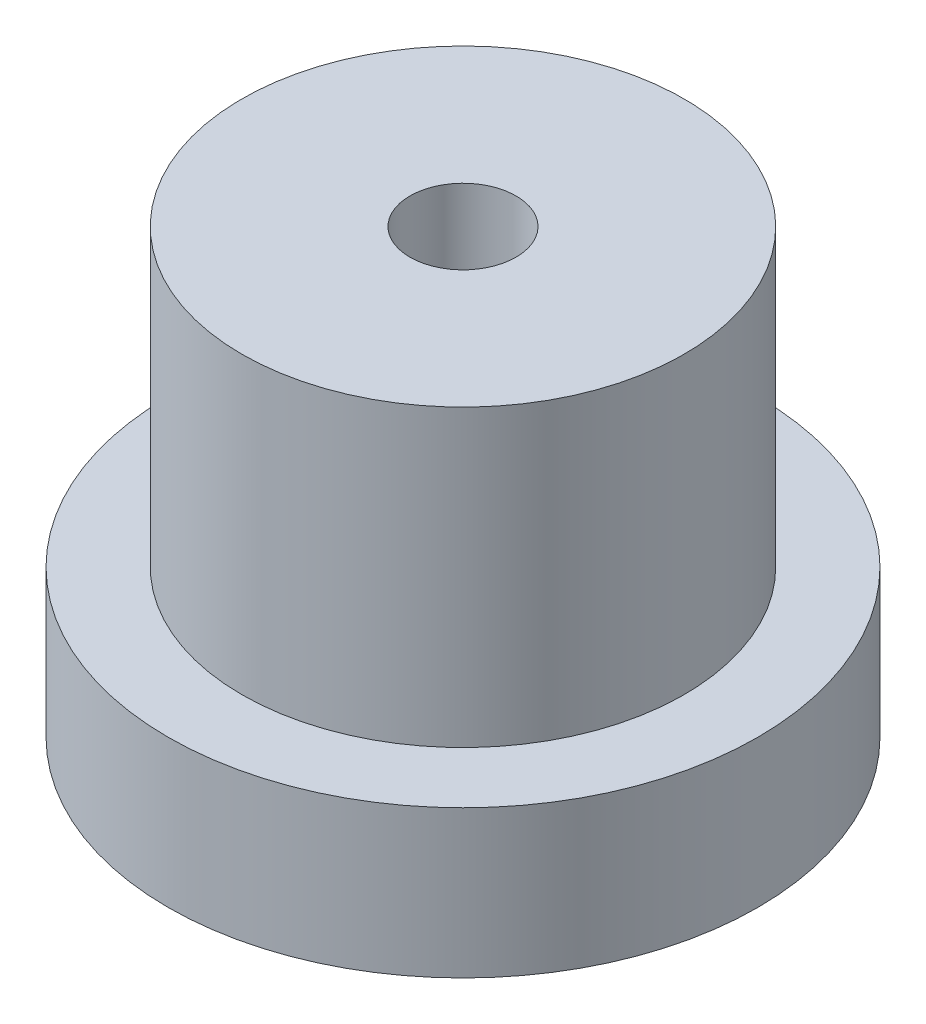
ISO-10303-21;
HEADER;
FILE_DESCRIPTION(('STEP AP214'),'2;1');
FILE_NAME('part.step','',(''),(''),'','','');
FILE_SCHEMA(('AUTOMOTIVE_DESIGN { 1 0 10303 214 1 1 1 1 }'));
ENDSEC;
DATA;
#1=APPLICATION_CONTEXT('core data for automotive mechanical design processes');
#2=APPLICATION_PROTOCOL_DEFINITION('international standard','automotive_design',2000,#1);
#3=PRODUCT_CONTEXT('',#1,'mechanical');
#4=PRODUCT('Part','Part','',(#3));
#5=PRODUCT_RELATED_PRODUCT_CATEGORY('part','',(#4));
#6=PRODUCT_DEFINITION_FORMATION('','',#4);
#7=PRODUCT_DEFINITION_CONTEXT('part definition',#1,'design');
#8=PRODUCT_DEFINITION('design','',#6,#7);
#9=PRODUCT_DEFINITION_SHAPE('','',#8);
#10=(LENGTH_UNIT() NAMED_UNIT(*) SI_UNIT(.MILLI.,.METRE.));
#11=(NAMED_UNIT(*) PLANE_ANGLE_UNIT() SI_UNIT($,.RADIAN.));
#12=(NAMED_UNIT(*) SI_UNIT($,.STERADIAN.) SOLID_ANGLE_UNIT());
#13=UNCERTAINTY_MEASURE_WITH_UNIT(LENGTH_MEASURE(1.E-05),#10,'distance_accuracy_value','');
#14=(GEOMETRIC_REPRESENTATION_CONTEXT(3) GLOBAL_UNCERTAINTY_ASSIGNED_CONTEXT((#13)) GLOBAL_UNIT_ASSIGNED_CONTEXT((#10,
#11,#12)) REPRESENTATION_CONTEXT('',''));
#15=CARTESIAN_POINT('',(0.,0.,0.));
#16=DIRECTION('',(0.,0.,1.));
#17=DIRECTION('',(1.,0.,0.));
#18=AXIS2_PLACEMENT_3D('',#15,#16,#17);
#19=CARTESIAN_POINT('',(0.,5.,0.));
#20=DIRECTION('',(0.,-1.,0.));
#21=DIRECTION('',(0.,0.,-1.));
#22=AXIS2_PLACEMENT_3D('',#19,#20,#21);
#23=CYLINDRICAL_SURFACE('',#22,10.);
#24=CARTESIAN_POINT('',(0.,5.,0.));
#25=DIRECTION('',(0.,1.,0.));
#26=DIRECTION('',(0.,0.,1.));
#27=AXIS2_PLACEMENT_3D('',#24,#25,#26);
#28=CIRCLE('',#27,10.);
#29=CARTESIAN_POINT('',(0.,5.,10.));
#30=VERTEX_POINT('',#29);
#31=EDGE_CURVE('E47',#30,#30,#28,.T.);
#32=ORIENTED_EDGE('',*,*,#31,.F.);
#33=EDGE_LOOP('',(#32));
#34=FACE_BOUND('',#33,.T.);
#35=CARTESIAN_POINT('',(0.,0.,0.));
#36=DIRECTION('',(0.,1.,0.));
#37=DIRECTION('',(0.,0.,1.));
#38=AXIS2_PLACEMENT_3D('',#35,#36,#37);
#39=CIRCLE('',#38,10.);
#40=CARTESIAN_POINT('',(0.,0.,10.));
#41=VERTEX_POINT('',#40);
#42=EDGE_CURVE('E42',#41,#41,#39,.T.);
#43=ORIENTED_EDGE('',*,*,#42,.T.);
#44=EDGE_LOOP('',(#43));
#45=FACE_BOUND('',#44,.T.);
#46=ADVANCED_FACE('F39',(#34,#45),#23,.T.);
#47=CARTESIAN_POINT('',(0.,5.,0.));
#48=DIRECTION('',(0.,1.,0.));
#49=DIRECTION('',(0.,0.,1.));
#50=AXIS2_PLACEMENT_3D('',#47,#48,#49);
#51=PLANE('',#50);
#52=CARTESIAN_POINT('',(0.,5.,0.));
#53=DIRECTION('',(0.,1.,0.));
#54=DIRECTION('',(0.,0.,1.));
#55=AXIS2_PLACEMENT_3D('',#52,#53,#54);
#56=CIRCLE('',#55,7.5);
#57=CARTESIAN_POINT('',(0.,5.,7.5));
#58=VERTEX_POINT('',#57);
#59=EDGE_CURVE('E11',#58,#58,#56,.T.);
#60=ORIENTED_EDGE('',*,*,#59,.F.);
#61=EDGE_LOOP('',(#60));
#62=FACE_BOUND('',#61,.T.);
#63=ORIENTED_EDGE('',*,*,#31,.T.);
#64=EDGE_LOOP('',(#63));
#65=FACE_BOUND('',#64,.T.);
#66=ADVANCED_FACE('F88',(#62,#65),#51,.T.);
#67=CARTESIAN_POINT('',(0.,0.,0.));
#68=DIRECTION('',(0.,1.,0.));
#69=DIRECTION('',(0.,0.,1.));
#70=AXIS2_PLACEMENT_3D('',#67,#68,#69);
#71=PLANE('',#70);
#72=ORIENTED_EDGE('',*,*,#42,.F.);
#73=EDGE_LOOP('',(#72));
#74=FACE_BOUND('',#73,.T.);
#75=ADVANCED_FACE('F83',(#74),#71,.F.);
#76=CARTESIAN_POINT('',(0.,15.,0.));
#77=DIRECTION('',(0.,-1.,0.));
#78=DIRECTION('',(0.,0.,-1.));
#79=AXIS2_PLACEMENT_3D('',#76,#77,#78);
#80=CYLINDRICAL_SURFACE('',#79,7.5);
#81=CARTESIAN_POINT('',(0.,15.,0.));
#82=DIRECTION('',(0.,1.,0.));
#83=DIRECTION('',(0.,0.,1.));
#84=AXIS2_PLACEMENT_3D('',#81,#82,#83);
#85=CIRCLE('',#84,7.5);
#86=CARTESIAN_POINT('',(0.,15.,7.5));
#87=VERTEX_POINT('',#86);
#88=EDGE_CURVE('E54',#87,#87,#85,.T.);
#89=ORIENTED_EDGE('',*,*,#88,.F.);
#90=EDGE_LOOP('',(#89));
#91=FACE_BOUND('',#90,.T.);
#92=ORIENTED_EDGE('',*,*,#59,.T.);
#93=EDGE_LOOP('',(#92));
#94=FACE_BOUND('',#93,.T.);
#95=ADVANCED_FACE('F78',(#91,#94),#80,.T.);
#96=CARTESIAN_POINT('',(0.,15.,0.));
#97=DIRECTION('',(0.,1.,0.));
#98=DIRECTION('',(0.,0.,1.));
#99=AXIS2_PLACEMENT_3D('',#96,#97,#98);
#100=PLANE('',#99);
#101=CARTESIAN_POINT('',(0.,15.,0.));
#102=DIRECTION('',(0.,1.,0.));
#103=DIRECTION('',(0.,0.,1.));
#104=AXIS2_PLACEMENT_3D('',#101,#102,#103);
#105=CIRCLE('',#104,1.8);
#106=CARTESIAN_POINT('',(0.,15.,1.8));
#107=VERTEX_POINT('',#106);
#108=EDGE_CURVE('E58',#107,#107,#105,.T.);
#109=ORIENTED_EDGE('',*,*,#108,.F.);
#110=EDGE_LOOP('',(#109));
#111=FACE_BOUND('',#110,.T.);
#112=ORIENTED_EDGE('',*,*,#88,.T.);
#113=EDGE_LOOP('',(#112));
#114=FACE_BOUND('',#113,.T.);
#115=ADVANCED_FACE('F72',(#111,#114),#100,.T.);
#116=CARTESIAN_POINT('',(0.,15.,0.));
#117=DIRECTION('',(0.,1.,0.));
#118=DIRECTION('',(0.,0.,1.));
#119=AXIS2_PLACEMENT_3D('',#116,#117,#118);
#120=CYLINDRICAL_SURFACE('',#119,1.8);
#121=CARTESIAN_POINT('',(0.,5.,0.));
#122=DIRECTION('',(0.,1.,0.));
#123=DIRECTION('',(0.,0.,1.));
#124=AXIS2_PLACEMENT_3D('',#121,#122,#123);
#125=CIRCLE('',#124,1.8);
#126=CARTESIAN_POINT('',(0.,5.,1.8));
#127=VERTEX_POINT('',#126);
#128=EDGE_CURVE('E62',#127,#127,#125,.T.);
#129=ORIENTED_EDGE('',*,*,#128,.F.);
#130=EDGE_LOOP('',(#129));
#131=FACE_BOUND('',#130,.T.);
#132=ORIENTED_EDGE('',*,*,#108,.T.);
#133=EDGE_LOOP('',(#132));
#134=FACE_BOUND('',#133,.T.);
#135=ADVANCED_FACE('F69',(#131,#134),#120,.F.);
#136=CARTESIAN_POINT('',(1.8,5.,0.));
#137=DIRECTION('',(0.,-1.,0.));
#138=DIRECTION('',(0.,0.,-1.));
#139=AXIS2_PLACEMENT_3D('',#136,#137,#138);
#140=PLANE('',#139);
#141=ORIENTED_EDGE('',*,*,#128,.T.);
#142=EDGE_LOOP('',(#141));
#143=FACE_BOUND('',#142,.T.);
#144=ADVANCED_FACE('F67',(#143),#140,.F.);
#145=CLOSED_SHELL('',(#46,#66,#75,#95,#115,#135,#144));
#146=MANIFOLD_SOLID_BREP('B2',#145);
#147=ADVANCED_BREP_SHAPE_REPRESENTATION('',(#18,#146),#14);
#148=SHAPE_DEFINITION_REPRESENTATION(#9,#147);
ENDSEC;
END-ISO-10303-21;
